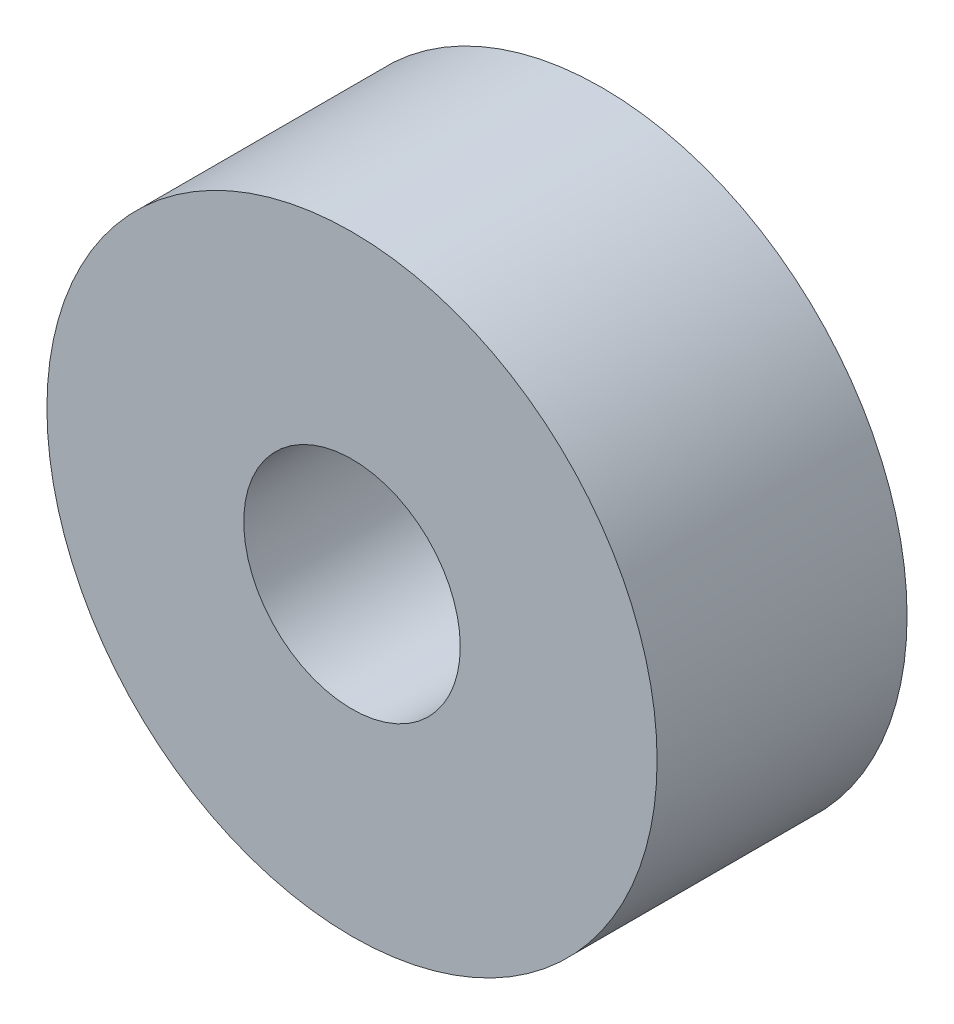
ISO-10303-21;
HEADER;
FILE_DESCRIPTION(('STEP AP214'),'2;1');
FILE_NAME('part.step','',(''),(''),'','','');
FILE_SCHEMA(('AUTOMOTIVE_DESIGN { 1 0 10303 214 1 1 1 1 }'));
ENDSEC;
DATA;
#1=APPLICATION_CONTEXT('core data for automotive mechanical design processes');
#2=APPLICATION_PROTOCOL_DEFINITION('international standard','automotive_design',2000,#1);
#3=PRODUCT_CONTEXT('',#1,'mechanical');
#4=PRODUCT('Part','Part','',(#3));
#5=PRODUCT_RELATED_PRODUCT_CATEGORY('part','',(#4));
#6=PRODUCT_DEFINITION_FORMATION('','',#4);
#7=PRODUCT_DEFINITION_CONTEXT('part definition',#1,'design');
#8=PRODUCT_DEFINITION('design','',#6,#7);
#9=PRODUCT_DEFINITION_SHAPE('','',#8);
#10=(LENGTH_UNIT() NAMED_UNIT(*) SI_UNIT(.MILLI.,.METRE.));
#11=(NAMED_UNIT(*) PLANE_ANGLE_UNIT() SI_UNIT($,.RADIAN.));
#12=(NAMED_UNIT(*) SI_UNIT($,.STERADIAN.) SOLID_ANGLE_UNIT());
#13=UNCERTAINTY_MEASURE_WITH_UNIT(LENGTH_MEASURE(1.E-05),#10,'distance_accuracy_value','');
#14=(GEOMETRIC_REPRESENTATION_CONTEXT(3) GLOBAL_UNCERTAINTY_ASSIGNED_CONTEXT((#13)) GLOBAL_UNIT_ASSIGNED_CONTEXT((#10,
#11,#12)) REPRESENTATION_CONTEXT('',''));
#15=CARTESIAN_POINT('',(0.,0.,0.));
#16=DIRECTION('',(0.,0.,1.));
#17=DIRECTION('',(1.,0.,0.));
#18=AXIS2_PLACEMENT_3D('',#15,#16,#17);
#19=CARTESIAN_POINT('',(0.,0.,3.175));
#20=DIRECTION('',(0.,0.,1.));
#21=DIRECTION('',(1.,0.,0.));
#22=AXIS2_PLACEMENT_3D('',#19,#20,#21);
#23=PLANE('',#22);
#24=CARTESIAN_POINT('',(0.,0.,3.175));
#25=DIRECTION('',(0.,0.,1.));
#26=DIRECTION('',(1.,0.,0.));
#27=AXIS2_PLACEMENT_3D('',#24,#25,#26);
#28=CIRCLE('',#27,7.75);
#29=CARTESIAN_POINT('',(7.75,0.,3.175));
#30=VERTEX_POINT('',#29);
#31=EDGE_CURVE('E10',#30,#30,#28,.T.);
#32=ORIENTED_EDGE('',*,*,#31,.T.);
#33=EDGE_LOOP('',(#32));
#34=FACE_BOUND('',#33,.T.);
#35=CARTESIAN_POINT('',(0.,0.,3.175));
#36=DIRECTION('',(0.,0.,1.));
#37=DIRECTION('',(1.,0.,0.));
#38=AXIS2_PLACEMENT_3D('',#35,#36,#37);
#39=CIRCLE('',#38,2.75);
#40=CARTESIAN_POINT('',(2.75,0.,3.175));
#41=VERTEX_POINT('',#40);
#42=EDGE_CURVE('E50',#41,#41,#39,.T.);
#43=ORIENTED_EDGE('',*,*,#42,.F.);
#44=EDGE_LOOP('',(#43));
#45=FACE_BOUND('',#44,.T.);
#46=ADVANCED_FACE('F37',(#34,#45),#23,.T.);
#47=CARTESIAN_POINT('',(0.,0.,-3.175));
#48=DIRECTION('',(0.,0.,1.));
#49=DIRECTION('',(1.,0.,0.));
#50=AXIS2_PLACEMENT_3D('',#47,#48,#49);
#51=PLANE('',#50);
#52=CARTESIAN_POINT('',(0.,0.,-3.175));
#53=DIRECTION('',(0.,0.,1.));
#54=DIRECTION('',(1.,0.,0.));
#55=AXIS2_PLACEMENT_3D('',#52,#53,#54);
#56=CIRCLE('',#55,7.75);
#57=CARTESIAN_POINT('',(7.75,0.,-3.175));
#58=VERTEX_POINT('',#57);
#59=EDGE_CURVE('E41',#58,#58,#56,.T.);
#60=ORIENTED_EDGE('',*,*,#59,.F.);
#61=EDGE_LOOP('',(#60));
#62=FACE_BOUND('',#61,.T.);
#63=CARTESIAN_POINT('',(0.,0.,-3.175));
#64=DIRECTION('',(0.,0.,1.));
#65=DIRECTION('',(1.,0.,0.));
#66=AXIS2_PLACEMENT_3D('',#63,#64,#65);
#67=CIRCLE('',#66,2.75);
#68=CARTESIAN_POINT('',(2.75,0.,-3.175));
#69=VERTEX_POINT('',#68);
#70=EDGE_CURVE('E52',#69,#69,#67,.T.);
#71=ORIENTED_EDGE('',*,*,#70,.T.);
#72=EDGE_LOOP('',(#71));
#73=FACE_BOUND('',#72,.T.);
#74=ADVANCED_FACE('F64',(#62,#73),#51,.F.);
#75=CARTESIAN_POINT('',(0.,0.,3.175));
#76=DIRECTION('',(0.,0.,-1.));
#77=DIRECTION('',(-1.,0.,0.));
#78=AXIS2_PLACEMENT_3D('',#75,#76,#77);
#79=CYLINDRICAL_SURFACE('',#78,7.75);
#80=ORIENTED_EDGE('',*,*,#31,.F.);
#81=EDGE_LOOP('',(#80));
#82=FACE_BOUND('',#81,.T.);
#83=ORIENTED_EDGE('',*,*,#59,.T.);
#84=EDGE_LOOP('',(#83));
#85=FACE_BOUND('',#84,.T.);
#86=ADVANCED_FACE('F39',(#82,#85),#79,.T.);
#87=CARTESIAN_POINT('',(0.,0.,3.175));
#88=DIRECTION('',(0.,0.,-1.));
#89=DIRECTION('',(-1.,0.,0.));
#90=AXIS2_PLACEMENT_3D('',#87,#88,#89);
#91=CYLINDRICAL_SURFACE('',#90,2.75);
#92=ORIENTED_EDGE('',*,*,#42,.T.);
#93=EDGE_LOOP('',(#92));
#94=FACE_BOUND('',#93,.T.);
#95=ORIENTED_EDGE('',*,*,#70,.F.);
#96=EDGE_LOOP('',(#95));
#97=FACE_BOUND('',#96,.T.);
#98=ADVANCED_FACE('F60',(#94,#97),#91,.F.);
#99=CLOSED_SHELL('',(#46,#74,#86,#98));
#100=MANIFOLD_SOLID_BREP('B2',#99);
#101=ADVANCED_BREP_SHAPE_REPRESENTATION('',(#18,#100),#14);
#102=SHAPE_DEFINITION_REPRESENTATION(#9,#101);
ENDSEC;
END-ISO-10303-21;
